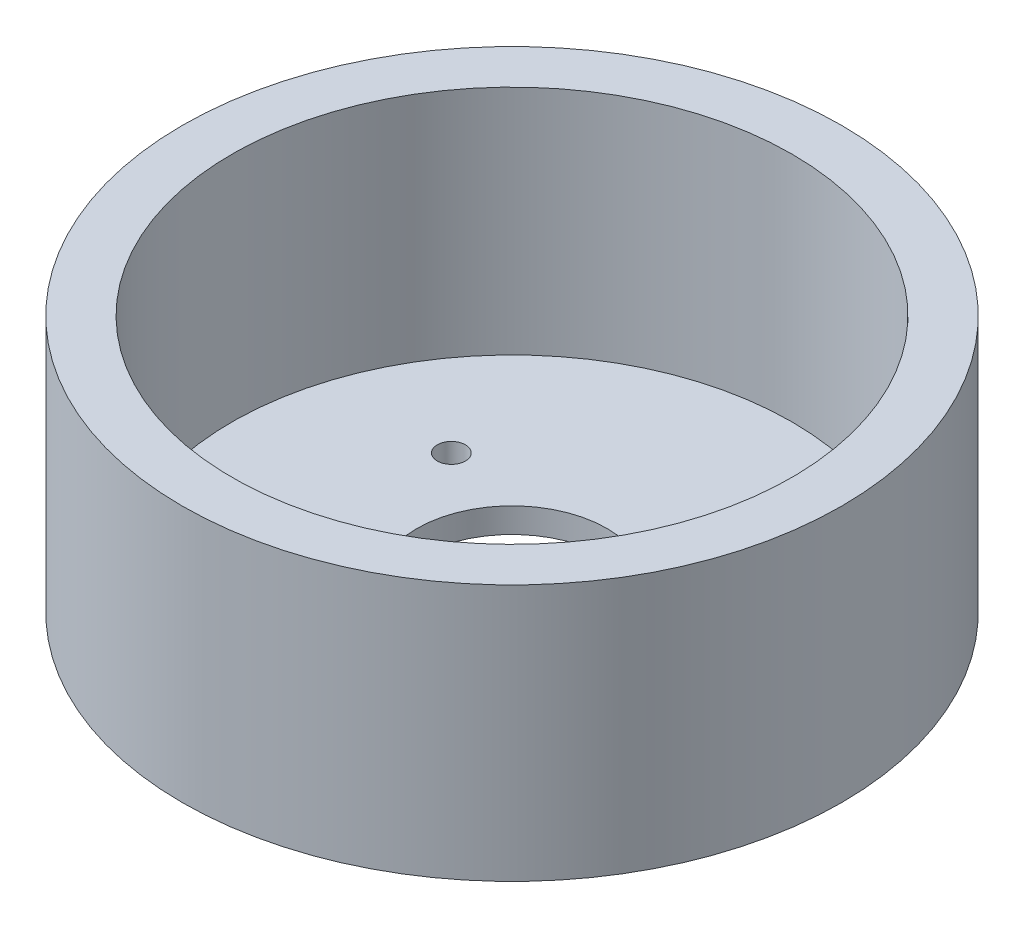
ISO-10303-21;
HEADER;
FILE_DESCRIPTION(('STEP AP214'),'2;1');
FILE_NAME('part.step','',(''),(''),'','','');
FILE_SCHEMA(('AUTOMOTIVE_DESIGN { 1 0 10303 214 1 1 1 1 }'));
ENDSEC;
DATA;
#1=APPLICATION_CONTEXT('core data for automotive mechanical design processes');
#2=APPLICATION_PROTOCOL_DEFINITION('international standard','automotive_design',2000,#1);
#3=PRODUCT_CONTEXT('',#1,'mechanical');
#4=PRODUCT('Part','Part','',(#3));
#5=PRODUCT_RELATED_PRODUCT_CATEGORY('part','',(#4));
#6=PRODUCT_DEFINITION_FORMATION('','',#4);
#7=PRODUCT_DEFINITION_CONTEXT('part definition',#1,'design');
#8=PRODUCT_DEFINITION('design','',#6,#7);
#9=PRODUCT_DEFINITION_SHAPE('','',#8);
#10=(LENGTH_UNIT() NAMED_UNIT(*) SI_UNIT(.MILLI.,.METRE.));
#11=(NAMED_UNIT(*) PLANE_ANGLE_UNIT() SI_UNIT($,.RADIAN.));
#12=(NAMED_UNIT(*) SI_UNIT($,.STERADIAN.) SOLID_ANGLE_UNIT());
#13=UNCERTAINTY_MEASURE_WITH_UNIT(LENGTH_MEASURE(1.E-05),#10,'distance_accuracy_value','');
#14=(GEOMETRIC_REPRESENTATION_CONTEXT(3) GLOBAL_UNCERTAINTY_ASSIGNED_CONTEXT((#13)) GLOBAL_UNIT_ASSIGNED_CONTEXT((#10,
#11,#12)) REPRESENTATION_CONTEXT('',''));
#15=CARTESIAN_POINT('',(0.,0.,0.));
#16=DIRECTION('',(0.,0.,1.));
#17=DIRECTION('',(1.,0.,0.));
#18=AXIS2_PLACEMENT_3D('',#15,#16,#17);
#19=CARTESIAN_POINT('',(0.,2.99999999999999,0.));
#20=DIRECTION('',(0.,1.,0.));
#21=DIRECTION('',(0.,0.,1.));
#22=AXIS2_PLACEMENT_3D('',#19,#20,#21);
#23=PLANE('',#22);
#24=CARTESIAN_POINT('',(-17.3205080756888,3.,-10.));
#25=DIRECTION('',(0.,1.,0.));
#26=DIRECTION('',(0.,0.,1.));
#27=AXIS2_PLACEMENT_3D('',#24,#25,#26);
#28=CIRCLE('',#27,1.70000000000018);
#29=CARTESIAN_POINT('',(-17.3205080756888,3.,-8.29999999999983));
#30=VERTEX_POINT('',#29);
#31=EDGE_CURVE('E55',#30,#30,#28,.T.);
#32=ORIENTED_EDGE('',*,*,#31,.F.);
#33=EDGE_LOOP('',(#32));
#34=FACE_BOUND('',#33,.T.);
#35=CARTESIAN_POINT('',(17.3205080756888,3.,-9.99999999999999));
#36=DIRECTION('',(0.,1.,0.));
#37=DIRECTION('',(0.,0.,1.));
#38=AXIS2_PLACEMENT_3D('',#35,#36,#37);
#39=CIRCLE('',#38,1.70000000000009);
#40=CARTESIAN_POINT('',(17.3205080756888,3.,-8.2999999999999));
#41=VERTEX_POINT('',#40);
#42=EDGE_CURVE('E58',#41,#41,#39,.T.);
#43=ORIENTED_EDGE('',*,*,#42,.F.);
#44=EDGE_LOOP('',(#43));
#45=FACE_BOUND('',#44,.T.);
#46=CARTESIAN_POINT('',(0.,3.,20.));
#47=DIRECTION('',(0.,1.,0.));
#48=DIRECTION('',(0.,0.,1.));
#49=AXIS2_PLACEMENT_3D('',#46,#47,#48);
#50=CIRCLE('',#49,1.7);
#51=CARTESIAN_POINT('',(0.,3.,21.7));
#52=VERTEX_POINT('',#51);
#53=EDGE_CURVE('E61',#52,#52,#50,.T.);
#54=ORIENTED_EDGE('',*,*,#53,.F.);
#55=EDGE_LOOP('',(#54));
#56=FACE_BOUND('',#55,.T.);
#57=CARTESIAN_POINT('',(0.,3.,0.));
#58=DIRECTION('',(0.,1.,0.));
#59=DIRECTION('',(0.,0.,1.));
#60=AXIS2_PLACEMENT_3D('',#57,#58,#59);
#61=CIRCLE('',#60,11.5);
#62=CARTESIAN_POINT('',(0.,3.,11.5));
#63=VERTEX_POINT('',#62);
#64=EDGE_CURVE('E64',#63,#63,#61,.T.);
#65=ORIENTED_EDGE('',*,*,#64,.F.);
#66=EDGE_LOOP('',(#65));
#67=FACE_BOUND('',#66,.T.);
#68=CARTESIAN_POINT('',(0.,3.,0.));
#69=DIRECTION('',(0.,-1.,0.));
#70=DIRECTION('',(0.,0.,-1.));
#71=AXIS2_PLACEMENT_3D('',#68,#69,#70);
#72=CIRCLE('',#71,33.8);
#73=CARTESIAN_POINT('',(0.,3.,-33.8));
#74=VERTEX_POINT('',#73);
#75=EDGE_CURVE('E10',#74,#74,#72,.T.);
#76=ORIENTED_EDGE('',*,*,#75,.F.);
#77=EDGE_LOOP('',(#76));
#78=FACE_BOUND('',#77,.T.);
#79=ADVANCED_FACE('F36',(#34,#45,#56,#67,#78),#23,.T.);
#80=CARTESIAN_POINT('',(0.,0.,0.));
#81=DIRECTION('',(0.,-1.,0.));
#82=DIRECTION('',(0.,0.,-1.));
#83=AXIS2_PLACEMENT_3D('',#80,#81,#82);
#84=CYLINDRICAL_SURFACE('',#83,33.8);
#85=ORIENTED_EDGE('',*,*,#75,.T.);
#86=EDGE_LOOP('',(#85));
#87=FACE_BOUND('',#86,.T.);
#88=CARTESIAN_POINT('',(0.,31.,0.));
#89=DIRECTION('',(0.,-1.,0.));
#90=DIRECTION('',(0.,0.,-1.));
#91=AXIS2_PLACEMENT_3D('',#88,#89,#90);
#92=CIRCLE('',#91,33.8);
#93=CARTESIAN_POINT('',(0.,31.,-33.8));
#94=VERTEX_POINT('',#93);
#95=EDGE_CURVE('E42',#94,#94,#92,.T.);
#96=ORIENTED_EDGE('',*,*,#95,.F.);
#97=EDGE_LOOP('',(#96));
#98=FACE_BOUND('',#97,.T.);
#99=ADVANCED_FACE('F100',(#87,#98),#84,.F.);
#100=CARTESIAN_POINT('',(33.8,31.,0.));
#101=DIRECTION('',(0.,1.,0.));
#102=DIRECTION('',(0.,0.,1.));
#103=AXIS2_PLACEMENT_3D('',#100,#101,#102);
#104=PLANE('',#103);
#105=ORIENTED_EDGE('',*,*,#95,.T.);
#106=EDGE_LOOP('',(#105));
#107=FACE_BOUND('',#106,.T.);
#108=CARTESIAN_POINT('',(0.,31.,0.));
#109=DIRECTION('',(0.,-1.,0.));
#110=DIRECTION('',(0.,0.,-1.));
#111=AXIS2_PLACEMENT_3D('',#108,#109,#110);
#112=CIRCLE('',#111,39.8);
#113=CARTESIAN_POINT('',(0.,31.,-39.8));
#114=VERTEX_POINT('',#113);
#115=EDGE_CURVE('E46',#114,#114,#112,.T.);
#116=ORIENTED_EDGE('',*,*,#115,.F.);
#117=EDGE_LOOP('',(#116));
#118=FACE_BOUND('',#117,.T.);
#119=ADVANCED_FACE('F94',(#107,#118),#104,.T.);
#120=CARTESIAN_POINT('',(0.,0.,0.));
#121=DIRECTION('',(0.,-1.,0.));
#122=DIRECTION('',(0.,0.,-1.));
#123=AXIS2_PLACEMENT_3D('',#120,#121,#122);
#124=CYLINDRICAL_SURFACE('',#123,39.8);
#125=ORIENTED_EDGE('',*,*,#115,.T.);
#126=EDGE_LOOP('',(#125));
#127=FACE_BOUND('',#126,.T.);
#128=CARTESIAN_POINT('',(0.,0.,0.));
#129=DIRECTION('',(0.,-1.,0.));
#130=DIRECTION('',(0.,0.,-1.));
#131=AXIS2_PLACEMENT_3D('',#128,#129,#130);
#132=CIRCLE('',#131,39.8);
#133=CARTESIAN_POINT('',(0.,0.,-39.8));
#134=VERTEX_POINT('',#133);
#135=EDGE_CURVE('E50',#134,#134,#132,.T.);
#136=ORIENTED_EDGE('',*,*,#135,.F.);
#137=EDGE_LOOP('',(#136));
#138=FACE_BOUND('',#137,.T.);
#139=ADVANCED_FACE('F86',(#127,#138),#124,.T.);
#140=CARTESIAN_POINT('',(39.8,0.,0.));
#141=DIRECTION('',(0.,-1.,0.));
#142=DIRECTION('',(0.,0.,-1.));
#143=AXIS2_PLACEMENT_3D('',#140,#141,#142);
#144=PLANE('',#143);
#145=CARTESIAN_POINT('',(-17.3205080756888,0.,-10.));
#146=DIRECTION('',(0.,-1.,0.));
#147=DIRECTION('',(0.,0.,-1.));
#148=AXIS2_PLACEMENT_3D('',#145,#146,#147);
#149=CIRCLE('',#148,1.70000000000018);
#150=CARTESIAN_POINT('',(-17.3205080756888,0.,-11.7000000000002));
#151=VERTEX_POINT('',#150);
#152=EDGE_CURVE('E71',#151,#151,#149,.T.);
#153=ORIENTED_EDGE('',*,*,#152,.F.);
#154=EDGE_LOOP('',(#153));
#155=FACE_BOUND('',#154,.T.);
#156=CARTESIAN_POINT('',(17.3205080756888,0.,-9.99999999999999));
#157=DIRECTION('',(0.,-1.,0.));
#158=DIRECTION('',(0.,0.,-1.));
#159=AXIS2_PLACEMENT_3D('',#156,#157,#158);
#160=CIRCLE('',#159,1.70000000000009);
#161=CARTESIAN_POINT('',(17.3205080756888,0.,-11.7000000000001));
#162=VERTEX_POINT('',#161);
#163=EDGE_CURVE('E74',#162,#162,#160,.T.);
#164=ORIENTED_EDGE('',*,*,#163,.F.);
#165=EDGE_LOOP('',(#164));
#166=FACE_BOUND('',#165,.T.);
#167=CARTESIAN_POINT('',(0.,0.,20.));
#168=DIRECTION('',(0.,-1.,0.));
#169=DIRECTION('',(0.,0.,-1.));
#170=AXIS2_PLACEMENT_3D('',#167,#168,#169);
#171=CIRCLE('',#170,1.7);
#172=CARTESIAN_POINT('',(0.,0.,18.3));
#173=VERTEX_POINT('',#172);
#174=EDGE_CURVE('E70',#173,#173,#171,.T.);
#175=ORIENTED_EDGE('',*,*,#174,.F.);
#176=EDGE_LOOP('',(#175));
#177=FACE_BOUND('',#176,.T.);
#178=CARTESIAN_POINT('',(0.,0.,0.));
#179=DIRECTION('',(0.,-1.,0.));
#180=DIRECTION('',(0.,0.,-1.));
#181=AXIS2_PLACEMENT_3D('',#178,#179,#180);
#182=CIRCLE('',#181,11.5);
#183=CARTESIAN_POINT('',(0.,0.,-11.5));
#184=VERTEX_POINT('',#183);
#185=EDGE_CURVE('E67',#184,#184,#182,.T.);
#186=ORIENTED_EDGE('',*,*,#185,.F.);
#187=EDGE_LOOP('',(#186));
#188=FACE_BOUND('',#187,.T.);
#189=ORIENTED_EDGE('',*,*,#135,.T.);
#190=EDGE_LOOP('',(#189));
#191=FACE_BOUND('',#190,.T.);
#192=ADVANCED_FACE('F82',(#155,#166,#177,#188,#191),#144,.T.);
#193=CARTESIAN_POINT('',(0.,31.,0.));
#194=DIRECTION('',(0.,-1.,0.));
#195=DIRECTION('',(0.,0.,-1.));
#196=AXIS2_PLACEMENT_3D('',#193,#194,#195);
#197=CYLINDRICAL_SURFACE('',#196,11.5);
#198=ORIENTED_EDGE('',*,*,#64,.T.);
#199=EDGE_LOOP('',(#198));
#200=FACE_BOUND('',#199,.T.);
#201=ORIENTED_EDGE('',*,*,#185,.T.);
#202=EDGE_LOOP('',(#201));
#203=FACE_BOUND('',#202,.T.);
#204=ADVANCED_FACE('F85',(#200,#203),#197,.F.);
#205=CARTESIAN_POINT('',(0.,31.,20.));
#206=DIRECTION('',(0.,-1.,0.));
#207=DIRECTION('',(0.,0.,-1.));
#208=AXIS2_PLACEMENT_3D('',#205,#206,#207);
#209=CYLINDRICAL_SURFACE('',#208,1.7);
#210=ORIENTED_EDGE('',*,*,#53,.T.);
#211=EDGE_LOOP('',(#210));
#212=FACE_BOUND('',#211,.T.);
#213=ORIENTED_EDGE('',*,*,#174,.T.);
#214=EDGE_LOOP('',(#213));
#215=FACE_BOUND('',#214,.T.);
#216=ADVANCED_FACE('F80',(#212,#215),#209,.F.);
#217=CARTESIAN_POINT('',(17.3205080756888,31.,-9.99999999999999));
#218=DIRECTION('',(0.,-1.,0.));
#219=DIRECTION('',(0.,0.,-1.));
#220=AXIS2_PLACEMENT_3D('',#217,#218,#219);
#221=CYLINDRICAL_SURFACE('',#220,1.70000000000009);
#222=ORIENTED_EDGE('',*,*,#42,.T.);
#223=EDGE_LOOP('',(#222));
#224=FACE_BOUND('',#223,.T.);
#225=ORIENTED_EDGE('',*,*,#163,.T.);
#226=EDGE_LOOP('',(#225));
#227=FACE_BOUND('',#226,.T.);
#228=ADVANCED_FACE('F122',(#224,#227),#221,.F.);
#229=CARTESIAN_POINT('',(-17.3205080756888,31.,-10.));
#230=DIRECTION('',(0.,-1.,0.));
#231=DIRECTION('',(0.,0.,-1.));
#232=AXIS2_PLACEMENT_3D('',#229,#230,#231);
#233=CYLINDRICAL_SURFACE('',#232,1.70000000000018);
#234=ORIENTED_EDGE('',*,*,#31,.T.);
#235=EDGE_LOOP('',(#234));
#236=FACE_BOUND('',#235,.T.);
#237=ORIENTED_EDGE('',*,*,#152,.T.);
#238=EDGE_LOOP('',(#237));
#239=FACE_BOUND('',#238,.T.);
#240=ADVANCED_FACE('F126',(#236,#239),#233,.F.);
#241=CLOSED_SHELL('',(#79,#99,#119,#139,#192,#204,#216,#228,#240));
#242=MANIFOLD_SOLID_BREP('B2',#241);
#243=ADVANCED_BREP_SHAPE_REPRESENTATION('',(#18,#242),#14);
#244=SHAPE_DEFINITION_REPRESENTATION(#9,#243);
ENDSEC;
END-ISO-10303-21;
